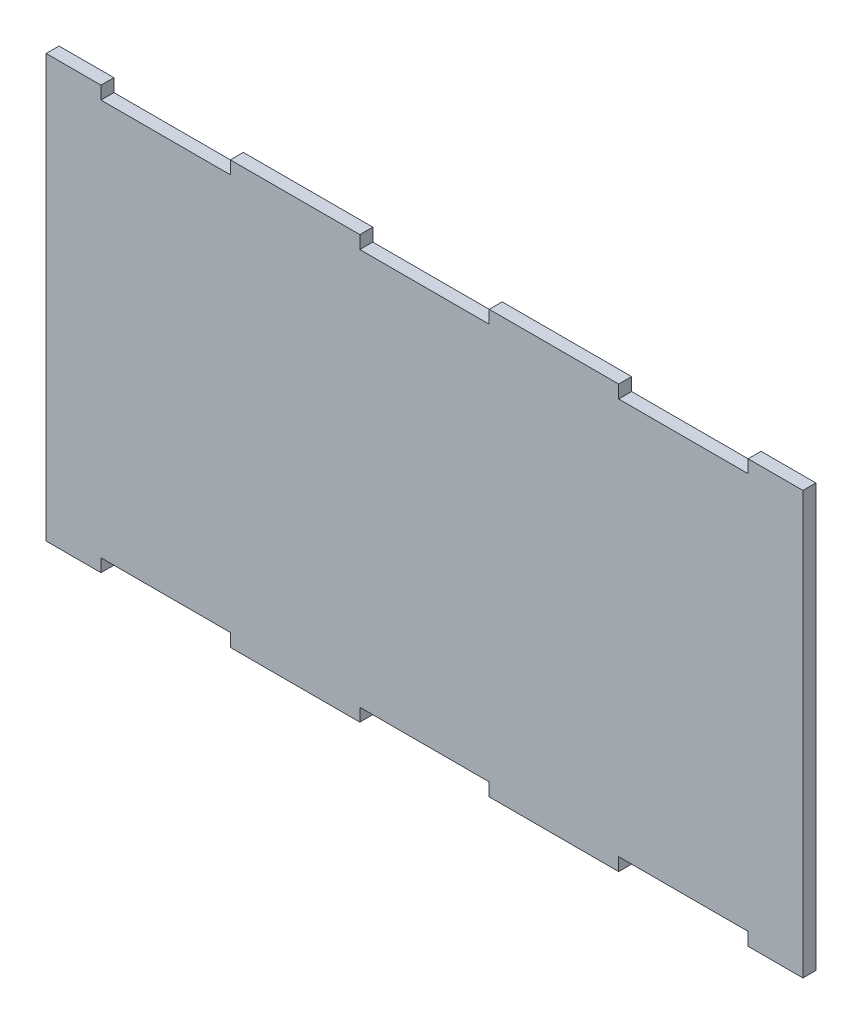
ISO-10303-21;
HEADER;
FILE_DESCRIPTION(('STEP AP214'),'2;1');
FILE_NAME('part.step','',(''),(''),'','','');
FILE_SCHEMA(('AUTOMOTIVE_DESIGN { 1 0 10303 214 1 1 1 1 }'));
ENDSEC;
DATA;
#1=APPLICATION_CONTEXT('core data for automotive mechanical design processes');
#2=APPLICATION_PROTOCOL_DEFINITION('international standard','automotive_design',2000,#1);
#3=PRODUCT_CONTEXT('',#1,'mechanical');
#4=PRODUCT('Part','Part','',(#3));
#5=PRODUCT_RELATED_PRODUCT_CATEGORY('part','',(#4));
#6=PRODUCT_DEFINITION_FORMATION('','',#4);
#7=PRODUCT_DEFINITION_CONTEXT('part definition',#1,'design');
#8=PRODUCT_DEFINITION('design','',#6,#7);
#9=PRODUCT_DEFINITION_SHAPE('','',#8);
#10=(LENGTH_UNIT() NAMED_UNIT(*) SI_UNIT(.MILLI.,.METRE.));
#11=(NAMED_UNIT(*) PLANE_ANGLE_UNIT() SI_UNIT($,.RADIAN.));
#12=(NAMED_UNIT(*) SI_UNIT($,.STERADIAN.) SOLID_ANGLE_UNIT());
#13=UNCERTAINTY_MEASURE_WITH_UNIT(LENGTH_MEASURE(1.E-05),#10,'distance_accuracy_value','');
#14=(GEOMETRIC_REPRESENTATION_CONTEXT(3) GLOBAL_UNCERTAINTY_ASSIGNED_CONTEXT((#13)) GLOBAL_UNIT_ASSIGNED_CONTEXT((#10,
#11,#12)) REPRESENTATION_CONTEXT('',''));
#15=CARTESIAN_POINT('',(0.,0.,0.));
#16=DIRECTION('',(0.,0.,1.));
#17=DIRECTION('',(1.,0.,0.));
#18=AXIS2_PLACEMENT_3D('',#15,#16,#17);
#19=CARTESIAN_POINT('',(-74.26325,-41.43375,2.54));
#20=DIRECTION('',(0.,1.,0.));
#21=DIRECTION('',(0.,0.,1.));
#22=AXIS2_PLACEMENT_3D('',#19,#20,#21);
#23=PLANE('',#22);
#24=DIRECTION('',(0.,0.,1.));
#25=VECTOR('',#24,1.);
#26=CARTESIAN_POINT('',(63.5,-41.43375,0.));
#27=LINE('',#26,#25);
#28=CARTESIAN_POINT('',(63.5,-41.43375,0.));
#29=VERTEX_POINT('',#28);
#30=CARTESIAN_POINT('',(63.5,-41.43375,2.54));
#31=VERTEX_POINT('',#30);
#32=EDGE_CURVE('E254',#29,#31,#27,.T.);
#33=ORIENTED_EDGE('',*,*,#32,.F.);
#34=DIRECTION('',(1.,0.,0.));
#35=VECTOR('',#34,1.);
#36=CARTESIAN_POINT('',(-74.26325,-41.43375,0.));
#37=LINE('',#36,#35);
#38=CARTESIAN_POINT('',(74.26325,-41.43375,0.));
#39=VERTEX_POINT('',#38);
#40=EDGE_CURVE('E243',#29,#39,#37,.T.);
#41=ORIENTED_EDGE('',*,*,#40,.T.);
#42=DIRECTION('',(0.,0.,-1.));
#43=VECTOR('',#42,1.);
#44=CARTESIAN_POINT('',(74.26325,-41.43375,2.54));
#45=LINE('',#44,#43);
#46=CARTESIAN_POINT('',(74.26325,-41.43375,2.54));
#47=VERTEX_POINT('',#46);
#48=EDGE_CURVE('E401',#47,#39,#45,.T.);
#49=ORIENTED_EDGE('',*,*,#48,.F.);
#50=DIRECTION('',(1.,0.,0.));
#51=VECTOR('',#50,1.);
#52=CARTESIAN_POINT('',(-74.26325,-41.43375,2.54));
#53=LINE('',#52,#51);
#54=EDGE_CURVE('E397',#31,#47,#53,.T.);
#55=ORIENTED_EDGE('',*,*,#54,.F.);
#56=EDGE_LOOP('',(#33,#41,#49,#55));
#57=FACE_BOUND('',#56,.T.);
#58=ADVANCED_FACE('F39',(#57),#23,.F.);
#59=DIRECTION('',(0.,0.,1.));
#60=VECTOR('',#59,1.);
#61=CARTESIAN_POINT('',(38.1,-41.43375,0.));
#62=LINE('',#61,#60);
#63=CARTESIAN_POINT('',(38.1,-41.43375,0.));
#64=VERTEX_POINT('',#63);
#65=CARTESIAN_POINT('',(38.1,-41.43375,2.54));
#66=VERTEX_POINT('',#65);
#67=EDGE_CURVE('E257',#64,#66,#62,.T.);
#68=ORIENTED_EDGE('',*,*,#67,.T.);
#69=CARTESIAN_POINT('',(12.7,-41.43375,2.54));
#70=VERTEX_POINT('',#69);
#71=EDGE_CURVE('E518',#70,#66,#53,.T.);
#72=ORIENTED_EDGE('',*,*,#71,.F.);
#73=DIRECTION('',(0.,0.,1.));
#74=VECTOR('',#73,1.);
#75=CARTESIAN_POINT('',(12.7,-41.43375,0.));
#76=LINE('',#75,#74);
#77=CARTESIAN_POINT('',(12.7,-41.43375,0.));
#78=VERTEX_POINT('',#77);
#79=EDGE_CURVE('E252',#78,#70,#76,.T.);
#80=ORIENTED_EDGE('',*,*,#79,.F.);
#81=EDGE_CURVE('E799',#78,#64,#37,.T.);
#82=ORIENTED_EDGE('',*,*,#81,.T.);
#83=EDGE_LOOP('',(#68,#72,#80,#82));
#84=FACE_BOUND('',#83,.T.);
#85=ADVANCED_FACE('F492',(#84),#23,.F.);
#86=DIRECTION('',(0.,0.,1.));
#87=VECTOR('',#86,1.);
#88=CARTESIAN_POINT('',(-12.7,-41.43375,0.));
#89=LINE('',#88,#87);
#90=CARTESIAN_POINT('',(-12.7,-41.43375,0.));
#91=VERTEX_POINT('',#90);
#92=CARTESIAN_POINT('',(-12.7,-41.43375,2.54));
#93=VERTEX_POINT('',#92);
#94=EDGE_CURVE('E279',#91,#93,#89,.T.);
#95=ORIENTED_EDGE('',*,*,#94,.T.);
#96=CARTESIAN_POINT('',(-38.1,-41.43375,2.54));
#97=VERTEX_POINT('',#96);
#98=EDGE_CURVE('E402',#97,#93,#53,.T.);
#99=ORIENTED_EDGE('',*,*,#98,.F.);
#100=DIRECTION('',(0.,0.,1.));
#101=VECTOR('',#100,1.);
#102=CARTESIAN_POINT('',(-38.1,-41.43375,0.));
#103=LINE('',#102,#101);
#104=CARTESIAN_POINT('',(-38.1,-41.43375,0.));
#105=VERTEX_POINT('',#104);
#106=EDGE_CURVE('E273',#105,#97,#103,.T.);
#107=ORIENTED_EDGE('',*,*,#106,.F.);
#108=EDGE_CURVE('E414',#105,#91,#37,.T.);
#109=ORIENTED_EDGE('',*,*,#108,.T.);
#110=EDGE_LOOP('',(#95,#99,#107,#109));
#111=FACE_BOUND('',#110,.T.);
#112=ADVANCED_FACE('F498',(#111),#23,.F.);
#113=DIRECTION('',(0.,0.,1.));
#114=VECTOR('',#113,1.);
#115=CARTESIAN_POINT('',(-63.5,-41.43375,0.));
#116=LINE('',#115,#114);
#117=CARTESIAN_POINT('',(-63.5,-41.43375,0.));
#118=VERTEX_POINT('',#117);
#119=CARTESIAN_POINT('',(-63.5,-41.43375,2.54));
#120=VERTEX_POINT('',#119);
#121=EDGE_CURVE('E302',#118,#120,#116,.T.);
#122=ORIENTED_EDGE('',*,*,#121,.T.);
#123=CARTESIAN_POINT('',(-74.26325,-41.43375,2.54));
#124=VERTEX_POINT('',#123);
#125=EDGE_CURVE('E398',#124,#120,#53,.T.);
#126=ORIENTED_EDGE('',*,*,#125,.F.);
#127=DIRECTION('',(0.,0.,-1.));
#128=VECTOR('',#127,1.);
#129=CARTESIAN_POINT('',(-74.26325,-41.43375,2.54));
#130=LINE('',#129,#128);
#131=CARTESIAN_POINT('',(-74.26325,-41.43375,0.));
#132=VERTEX_POINT('',#131);
#133=EDGE_CURVE('E417',#124,#132,#130,.T.);
#134=ORIENTED_EDGE('',*,*,#133,.T.);
#135=EDGE_CURVE('E390',#132,#118,#37,.T.);
#136=ORIENTED_EDGE('',*,*,#135,.T.);
#137=EDGE_LOOP('',(#122,#126,#134,#136));
#138=FACE_BOUND('',#137,.T.);
#139=ADVANCED_FACE('F433',(#138),#23,.F.);
#140=CARTESIAN_POINT('',(0.,0.,2.54));
#141=DIRECTION('',(0.,0.,1.));
#142=DIRECTION('',(1.,0.,0.));
#143=AXIS2_PLACEMENT_3D('',#140,#141,#142);
#144=PLANE('',#143);
#145=DIRECTION('',(1.,0.,0.));
#146=VECTOR('',#145,1.);
#147=CARTESIAN_POINT('',(63.5,-38.89375,2.54));
#148=LINE('',#147,#146);
#149=CARTESIAN_POINT('',(38.1,-38.89375,2.54));
#150=VERTEX_POINT('',#149);
#151=CARTESIAN_POINT('',(63.5,-38.89375,2.54));
#152=VERTEX_POINT('',#151);
#153=EDGE_CURVE('E247',#150,#152,#148,.T.);
#154=ORIENTED_EDGE('',*,*,#153,.T.);
#155=DIRECTION('',(0.,-1.,0.));
#156=VECTOR('',#155,1.);
#157=CARTESIAN_POINT('',(63.5,-41.43375,2.54));
#158=LINE('',#157,#156);
#159=EDGE_CURVE('E237',#152,#31,#158,.T.);
#160=ORIENTED_EDGE('',*,*,#159,.T.);
#161=ORIENTED_EDGE('',*,*,#54,.T.);
#162=DIRECTION('',(0.,1.,0.));
#163=VECTOR('',#162,1.);
#164=CARTESIAN_POINT('',(74.26325,41.43375,2.54));
#165=LINE('',#164,#163);
#166=CARTESIAN_POINT('',(74.26325,41.43375,2.54));
#167=VERTEX_POINT('',#166);
#168=EDGE_CURVE('E386',#47,#167,#165,.T.);
#169=ORIENTED_EDGE('',*,*,#168,.T.);
#170=DIRECTION('',(-1.,0.,0.));
#171=VECTOR('',#170,1.);
#172=CARTESIAN_POINT('',(-74.26325,41.43375,2.54));
#173=LINE('',#172,#171);
#174=CARTESIAN_POINT('',(63.5,41.43375,2.54));
#175=VERTEX_POINT('',#174);
#176=EDGE_CURVE('E391',#167,#175,#173,.T.);
#177=ORIENTED_EDGE('',*,*,#176,.T.);
#178=DIRECTION('',(0.,1.,0.));
#179=VECTOR('',#178,1.);
#180=CARTESIAN_POINT('',(63.5,41.43375,2.54));
#181=LINE('',#180,#179);
#182=CARTESIAN_POINT('',(63.5,38.89375,2.54));
#183=VERTEX_POINT('',#182);
#184=EDGE_CURVE('E329',#183,#175,#181,.T.);
#185=ORIENTED_EDGE('',*,*,#184,.F.);
#186=DIRECTION('',(1.,0.,0.));
#187=VECTOR('',#186,1.);
#188=CARTESIAN_POINT('',(63.5,38.89375,2.54));
#189=LINE('',#188,#187);
#190=CARTESIAN_POINT('',(38.1,38.89375,2.54));
#191=VERTEX_POINT('',#190);
#192=EDGE_CURVE('E364',#191,#183,#189,.T.);
#193=ORIENTED_EDGE('',*,*,#192,.F.);
#194=DIRECTION('',(0.,-1.,0.));
#195=VECTOR('',#194,1.);
#196=CARTESIAN_POINT('',(38.1,41.43375,2.54));
#197=LINE('',#196,#195);
#198=CARTESIAN_POINT('',(38.1,41.43375,2.54));
#199=VERTEX_POINT('',#198);
#200=EDGE_CURVE('E372',#199,#191,#197,.T.);
#201=ORIENTED_EDGE('',*,*,#200,.F.);
#202=CARTESIAN_POINT('',(12.7,41.43375,2.54));
#203=VERTEX_POINT('',#202);
#204=EDGE_CURVE('E395',#199,#203,#173,.T.);
#205=ORIENTED_EDGE('',*,*,#204,.T.);
#206=DIRECTION('',(0.,1.,0.));
#207=VECTOR('',#206,1.);
#208=CARTESIAN_POINT('',(12.7,41.43375,2.54));
#209=LINE('',#208,#207);
#210=CARTESIAN_POINT('',(12.7,38.89375,2.54));
#211=VERTEX_POINT('',#210);
#212=EDGE_CURVE('E319',#211,#203,#209,.T.);
#213=ORIENTED_EDGE('',*,*,#212,.F.);
#214=DIRECTION('',(1.,0.,0.));
#215=VECTOR('',#214,1.);
#216=CARTESIAN_POINT('',(12.7,38.89375,2.54));
#217=LINE('',#216,#215);
#218=CARTESIAN_POINT('',(-12.7,38.89375,2.54));
#219=VERTEX_POINT('',#218);
#220=EDGE_CURVE('E312',#219,#211,#217,.T.);
#221=ORIENTED_EDGE('',*,*,#220,.F.);
#222=DIRECTION('',(0.,-1.,0.));
#223=VECTOR('',#222,1.);
#224=CARTESIAN_POINT('',(-12.7,41.43375,2.54));
#225=LINE('',#224,#223);
#226=CARTESIAN_POINT('',(-12.7,41.43375,2.54));
#227=VERTEX_POINT('',#226);
#228=EDGE_CURVE('E321',#227,#219,#225,.T.);
#229=ORIENTED_EDGE('',*,*,#228,.F.);
#230=CARTESIAN_POINT('',(-38.1,41.43375,2.54));
#231=VERTEX_POINT('',#230);
#232=EDGE_CURVE('E440',#227,#231,#173,.T.);
#233=ORIENTED_EDGE('',*,*,#232,.T.);
#234=DIRECTION('',(0.,1.,0.));
#235=VECTOR('',#234,1.);
#236=CARTESIAN_POINT('',(-38.1,41.43375,2.54));
#237=LINE('',#236,#235);
#238=CARTESIAN_POINT('',(-38.1,38.89375,2.54));
#239=VERTEX_POINT('',#238);
#240=EDGE_CURVE('E256',#239,#231,#237,.T.);
#241=ORIENTED_EDGE('',*,*,#240,.F.);
#242=DIRECTION('',(1.,0.,0.));
#243=VECTOR('',#242,1.);
#244=CARTESIAN_POINT('',(-38.1,38.89375,2.54));
#245=LINE('',#244,#243);
#246=CARTESIAN_POINT('',(-63.5,38.89375,2.54));
#247=VERTEX_POINT('',#246);
#248=EDGE_CURVE('E340',#247,#239,#245,.T.);
#249=ORIENTED_EDGE('',*,*,#248,.F.);
#250=DIRECTION('',(0.,-1.,0.));
#251=VECTOR('',#250,1.);
#252=CARTESIAN_POINT('',(-63.5,41.43375,2.54));
#253=LINE('',#252,#251);
#254=CARTESIAN_POINT('',(-63.5,41.43375,2.54));
#255=VERTEX_POINT('',#254);
#256=EDGE_CURVE('E348',#255,#247,#253,.T.);
#257=ORIENTED_EDGE('',*,*,#256,.F.);
#258=CARTESIAN_POINT('',(-74.26325,41.43375,2.54));
#259=VERTEX_POINT('',#258);
#260=EDGE_CURVE('E389',#255,#259,#173,.T.);
#261=ORIENTED_EDGE('',*,*,#260,.T.);
#262=DIRECTION('',(0.,-1.,0.));
#263=VECTOR('',#262,1.);
#264=CARTESIAN_POINT('',(-74.26325,41.43375,2.54));
#265=LINE('',#264,#263);
#266=EDGE_CURVE('E394',#259,#124,#265,.T.);
#267=ORIENTED_EDGE('',*,*,#266,.T.);
#268=ORIENTED_EDGE('',*,*,#125,.T.);
#269=DIRECTION('',(0.,1.,0.));
#270=VECTOR('',#269,1.);
#271=CARTESIAN_POINT('',(-63.5,-41.43375,2.54));
#272=LINE('',#271,#270);
#273=CARTESIAN_POINT('',(-63.5,-38.89375,2.54));
#274=VERTEX_POINT('',#273);
#275=EDGE_CURVE('E287',#120,#274,#272,.T.);
#276=ORIENTED_EDGE('',*,*,#275,.T.);
#277=DIRECTION('',(1.,0.,0.));
#278=VECTOR('',#277,1.);
#279=CARTESIAN_POINT('',(-38.1,-38.89375,2.54));
#280=LINE('',#279,#278);
#281=CARTESIAN_POINT('',(-38.1,-38.89375,2.54));
#282=VERTEX_POINT('',#281);
#283=EDGE_CURVE('E296',#274,#282,#280,.T.);
#284=ORIENTED_EDGE('',*,*,#283,.T.);
#285=DIRECTION('',(0.,-1.,0.));
#286=VECTOR('',#285,1.);
#287=CARTESIAN_POINT('',(-38.1,-41.43375,2.54));
#288=LINE('',#287,#286);
#289=EDGE_CURVE('E293',#282,#97,#288,.T.);
#290=ORIENTED_EDGE('',*,*,#289,.T.);
#291=ORIENTED_EDGE('',*,*,#98,.T.);
#292=DIRECTION('',(0.,1.,0.));
#293=VECTOR('',#292,1.);
#294=CARTESIAN_POINT('',(-12.7,-41.43375,2.54));
#295=LINE('',#294,#293);
#296=CARTESIAN_POINT('',(-12.7,-38.89375,2.54));
#297=VERTEX_POINT('',#296);
#298=EDGE_CURVE('E264',#93,#297,#295,.T.);
#299=ORIENTED_EDGE('',*,*,#298,.T.);
#300=DIRECTION('',(1.,0.,0.));
#301=VECTOR('',#300,1.);
#302=CARTESIAN_POINT('',(12.7,-38.89375,2.54));
#303=LINE('',#302,#301);
#304=CARTESIAN_POINT('',(12.7,-38.89375,2.54));
#305=VERTEX_POINT('',#304);
#306=EDGE_CURVE('E272',#297,#305,#303,.T.);
#307=ORIENTED_EDGE('',*,*,#306,.T.);
#308=DIRECTION('',(0.,-1.,0.));
#309=VECTOR('',#308,1.);
#310=CARTESIAN_POINT('',(12.7,-41.43375,2.54));
#311=LINE('',#310,#309);
#312=EDGE_CURVE('E269',#305,#70,#311,.T.);
#313=ORIENTED_EDGE('',*,*,#312,.T.);
#314=ORIENTED_EDGE('',*,*,#71,.T.);
#315=DIRECTION('',(0.,1.,0.));
#316=VECTOR('',#315,1.);
#317=CARTESIAN_POINT('',(38.1,-41.43375,2.54));
#318=LINE('',#317,#316);
#319=EDGE_CURVE('E244',#66,#150,#318,.T.);
#320=ORIENTED_EDGE('',*,*,#319,.T.);
#321=EDGE_LOOP('',(#154,#160,#161,#169,#177,#185,#193,#201,#205,#213,#221,#229,#233,#241,#249,
#257,#261,#267,#268,#276,#284,#290,#291,#299,#307,#313,#314,#320));
#322=FACE_BOUND('',#321,.T.);
#323=ADVANCED_FACE('F436',(#322),#144,.T.);
#324=CARTESIAN_POINT('',(0.,0.,0.));
#325=DIRECTION('',(0.,0.,1.));
#326=DIRECTION('',(1.,0.,0.));
#327=AXIS2_PLACEMENT_3D('',#324,#325,#326);
#328=PLANE('',#327);
#329=DIRECTION('',(0.,-1.,0.));
#330=VECTOR('',#329,1.);
#331=CARTESIAN_POINT('',(63.5,-41.43375,0.));
#332=LINE('',#331,#330);
#333=CARTESIAN_POINT('',(63.5,-38.89375,0.));
#334=VERTEX_POINT('',#333);
#335=EDGE_CURVE('E231',#334,#29,#332,.T.);
#336=ORIENTED_EDGE('',*,*,#335,.F.);
#337=DIRECTION('',(1.,0.,0.));
#338=VECTOR('',#337,1.);
#339=CARTESIAN_POINT('',(63.5,-38.89375,0.));
#340=LINE('',#339,#338);
#341=CARTESIAN_POINT('',(38.1,-38.89375,0.));
#342=VERTEX_POINT('',#341);
#343=EDGE_CURVE('E222',#342,#334,#340,.T.);
#344=ORIENTED_EDGE('',*,*,#343,.F.);
#345=DIRECTION('',(0.,1.,0.));
#346=VECTOR('',#345,1.);
#347=CARTESIAN_POINT('',(38.1,-41.43375,0.));
#348=LINE('',#347,#346);
#349=EDGE_CURVE('E230',#64,#342,#348,.T.);
#350=ORIENTED_EDGE('',*,*,#349,.F.);
#351=ORIENTED_EDGE('',*,*,#81,.F.);
#352=DIRECTION('',(0.,-1.,0.));
#353=VECTOR('',#352,1.);
#354=CARTESIAN_POINT('',(12.7,-41.43375,0.));
#355=LINE('',#354,#353);
#356=CARTESIAN_POINT('',(12.7,-38.89375,0.));
#357=VERTEX_POINT('',#356);
#358=EDGE_CURVE('E261',#357,#78,#355,.T.);
#359=ORIENTED_EDGE('',*,*,#358,.F.);
#360=DIRECTION('',(1.,0.,0.));
#361=VECTOR('',#360,1.);
#362=CARTESIAN_POINT('',(12.7,-38.89375,0.));
#363=LINE('',#362,#361);
#364=CARTESIAN_POINT('',(-12.7,-38.89375,0.));
#365=VERTEX_POINT('',#364);
#366=EDGE_CURVE('E263',#365,#357,#363,.T.);
#367=ORIENTED_EDGE('',*,*,#366,.F.);
#368=DIRECTION('',(0.,1.,0.));
#369=VECTOR('',#368,1.);
#370=CARTESIAN_POINT('',(-12.7,-41.43375,0.));
#371=LINE('',#370,#369);
#372=EDGE_CURVE('E266',#91,#365,#371,.T.);
#373=ORIENTED_EDGE('',*,*,#372,.F.);
#374=ORIENTED_EDGE('',*,*,#108,.F.);
#375=DIRECTION('',(0.,-1.,0.));
#376=VECTOR('',#375,1.);
#377=CARTESIAN_POINT('',(-38.1,-41.43375,0.));
#378=LINE('',#377,#376);
#379=CARTESIAN_POINT('',(-38.1,-38.89375,0.));
#380=VERTEX_POINT('',#379);
#381=EDGE_CURVE('E284',#380,#105,#378,.T.);
#382=ORIENTED_EDGE('',*,*,#381,.F.);
#383=DIRECTION('',(1.,0.,0.));
#384=VECTOR('',#383,1.);
#385=CARTESIAN_POINT('',(-38.1,-38.89375,0.));
#386=LINE('',#385,#384);
#387=CARTESIAN_POINT('',(-63.5,-38.89375,0.));
#388=VERTEX_POINT('',#387);
#389=EDGE_CURVE('E286',#388,#380,#386,.T.);
#390=ORIENTED_EDGE('',*,*,#389,.F.);
#391=DIRECTION('',(0.,1.,0.));
#392=VECTOR('',#391,1.);
#393=CARTESIAN_POINT('',(-63.5,-41.43375,0.));
#394=LINE('',#393,#392);
#395=EDGE_CURVE('E289',#118,#388,#394,.T.);
#396=ORIENTED_EDGE('',*,*,#395,.F.);
#397=ORIENTED_EDGE('',*,*,#135,.F.);
#398=DIRECTION('',(0.,-1.,0.));
#399=VECTOR('',#398,1.);
#400=CARTESIAN_POINT('',(-74.26325,41.43375,0.));
#401=LINE('',#400,#399);
#402=CARTESIAN_POINT('',(-74.26325,41.43375,0.));
#403=VERTEX_POINT('',#402);
#404=EDGE_CURVE('E409',#403,#132,#401,.T.);
#405=ORIENTED_EDGE('',*,*,#404,.F.);
#406=DIRECTION('',(-1.,0.,0.));
#407=VECTOR('',#406,1.);
#408=CARTESIAN_POINT('',(-74.26325,41.43375,0.));
#409=LINE('',#408,#407);
#410=CARTESIAN_POINT('',(-63.5,41.43375,0.));
#411=VERTEX_POINT('',#410);
#412=EDGE_CURVE('E405',#411,#403,#409,.T.);
#413=ORIENTED_EDGE('',*,*,#412,.F.);
#414=DIRECTION('',(0.,-1.,0.));
#415=VECTOR('',#414,1.);
#416=CARTESIAN_POINT('',(-63.5,41.43375,0.));
#417=LINE('',#416,#415);
#418=CARTESIAN_POINT('',(-63.5,38.89375,0.));
#419=VERTEX_POINT('',#418);
#420=EDGE_CURVE('E339',#411,#419,#417,.T.);
#421=ORIENTED_EDGE('',*,*,#420,.T.);
#422=DIRECTION('',(1.,0.,0.));
#423=VECTOR('',#422,1.);
#424=CARTESIAN_POINT('',(-38.1,38.89375,0.));
#425=LINE('',#424,#423);
#426=CARTESIAN_POINT('',(-38.1,38.89375,0.));
#427=VERTEX_POINT('',#426);
#428=EDGE_CURVE('E343',#419,#427,#425,.T.);
#429=ORIENTED_EDGE('',*,*,#428,.T.);
#430=DIRECTION('',(0.,1.,0.));
#431=VECTOR('',#430,1.);
#432=CARTESIAN_POINT('',(-38.1,41.43375,0.));
#433=LINE('',#432,#431);
#434=CARTESIAN_POINT('',(-38.1,41.43375,0.));
#435=VERTEX_POINT('',#434);
#436=EDGE_CURVE('E336',#427,#435,#433,.T.);
#437=ORIENTED_EDGE('',*,*,#436,.T.);
#438=CARTESIAN_POINT('',(-12.7,41.43375,0.));
#439=VERTEX_POINT('',#438);
#440=EDGE_CURVE('E469',#439,#435,#409,.T.);
#441=ORIENTED_EDGE('',*,*,#440,.F.);
#442=DIRECTION('',(0.,-1.,0.));
#443=VECTOR('',#442,1.);
#444=CARTESIAN_POINT('',(-12.7,41.43375,0.));
#445=LINE('',#444,#443);
#446=CARTESIAN_POINT('',(-12.7,38.89375,0.));
#447=VERTEX_POINT('',#446);
#448=EDGE_CURVE('E311',#439,#447,#445,.T.);
#449=ORIENTED_EDGE('',*,*,#448,.T.);
#450=DIRECTION('',(1.,0.,0.));
#451=VECTOR('',#450,1.);
#452=CARTESIAN_POINT('',(12.7,38.89375,0.));
#453=LINE('',#452,#451);
#454=CARTESIAN_POINT('',(12.7,38.89375,0.));
#455=VERTEX_POINT('',#454);
#456=EDGE_CURVE('E315',#447,#455,#453,.T.);
#457=ORIENTED_EDGE('',*,*,#456,.T.);
#458=DIRECTION('',(0.,1.,0.));
#459=VECTOR('',#458,1.);
#460=CARTESIAN_POINT('',(12.7,41.43375,0.));
#461=LINE('',#460,#459);
#462=CARTESIAN_POINT('',(12.7,41.43375,0.));
#463=VERTEX_POINT('',#462);
#464=EDGE_CURVE('E308',#455,#463,#461,.T.);
#465=ORIENTED_EDGE('',*,*,#464,.T.);
#466=CARTESIAN_POINT('',(38.1,41.43375,0.));
#467=VERTEX_POINT('',#466);
#468=EDGE_CURVE('E410',#467,#463,#409,.T.);
#469=ORIENTED_EDGE('',*,*,#468,.F.);
#470=DIRECTION('',(0.,-1.,0.));
#471=VECTOR('',#470,1.);
#472=CARTESIAN_POINT('',(38.1,41.43375,0.));
#473=LINE('',#472,#471);
#474=CARTESIAN_POINT('',(38.1,38.89375,0.));
#475=VERTEX_POINT('',#474);
#476=EDGE_CURVE('E363',#467,#475,#473,.T.);
#477=ORIENTED_EDGE('',*,*,#476,.T.);
#478=DIRECTION('',(1.,0.,0.));
#479=VECTOR('',#478,1.);
#480=CARTESIAN_POINT('',(63.5,38.89375,0.));
#481=LINE('',#480,#479);
#482=CARTESIAN_POINT('',(63.5,38.89375,0.));
#483=VERTEX_POINT('',#482);
#484=EDGE_CURVE('E367',#475,#483,#481,.T.);
#485=ORIENTED_EDGE('',*,*,#484,.T.);
#486=DIRECTION('',(0.,1.,0.));
#487=VECTOR('',#486,1.);
#488=CARTESIAN_POINT('',(63.5,41.43375,0.));
#489=LINE('',#488,#487);
#490=CARTESIAN_POINT('',(63.5,41.43375,0.));
#491=VERTEX_POINT('',#490);
#492=EDGE_CURVE('E360',#483,#491,#489,.T.);
#493=ORIENTED_EDGE('',*,*,#492,.T.);
#494=CARTESIAN_POINT('',(74.26325,41.43375,0.));
#495=VERTEX_POINT('',#494);
#496=EDGE_CURVE('E406',#495,#491,#409,.T.);
#497=ORIENTED_EDGE('',*,*,#496,.F.);
#498=DIRECTION('',(0.,1.,0.));
#499=VECTOR('',#498,1.);
#500=CARTESIAN_POINT('',(74.26325,41.43375,0.));
#501=LINE('',#500,#499);
#502=EDGE_CURVE('E379',#39,#495,#501,.T.);
#503=ORIENTED_EDGE('',*,*,#502,.F.);
#504=ORIENTED_EDGE('',*,*,#40,.F.);
#505=EDGE_LOOP('',(#336,#344,#350,#351,#359,#367,#373,#374,#382,#390,#396,#397,#405,#413,#421,
#429,#437,#441,#449,#457,#465,#469,#477,#485,#493,#497,#503,#504));
#506=FACE_BOUND('',#505,.T.);
#507=ADVANCED_FACE('F241',(#506),#328,.F.);
#508=CARTESIAN_POINT('',(-74.26325,41.43375,2.54));
#509=DIRECTION('',(0.,-1.,0.));
#510=DIRECTION('',(0.,0.,-1.));
#511=AXIS2_PLACEMENT_3D('',#508,#509,#510);
#512=PLANE('',#511);
#513=ORIENTED_EDGE('',*,*,#468,.T.);
#514=DIRECTION('',(0.,0.,1.));
#515=VECTOR('',#514,1.);
#516=CARTESIAN_POINT('',(12.7,41.43375,0.));
#517=LINE('',#516,#515);
#518=EDGE_CURVE('E318',#463,#203,#517,.T.);
#519=ORIENTED_EDGE('',*,*,#518,.T.);
#520=ORIENTED_EDGE('',*,*,#204,.F.);
#521=DIRECTION('',(0.,0.,1.));
#522=VECTOR('',#521,1.);
#523=CARTESIAN_POINT('',(38.1,41.43375,0.));
#524=LINE('',#523,#522);
#525=EDGE_CURVE('E382',#467,#199,#524,.T.);
#526=ORIENTED_EDGE('',*,*,#525,.F.);
#527=EDGE_LOOP('',(#513,#519,#520,#526));
#528=FACE_BOUND('',#527,.T.);
#529=ADVANCED_FACE('F454',(#528),#512,.F.);
#530=ORIENTED_EDGE('',*,*,#232,.F.);
#531=DIRECTION('',(0.,0.,1.));
#532=VECTOR('',#531,1.);
#533=CARTESIAN_POINT('',(-12.7,41.43375,0.));
#534=LINE('',#533,#532);
#535=EDGE_CURVE('E332',#439,#227,#534,.T.);
#536=ORIENTED_EDGE('',*,*,#535,.F.);
#537=ORIENTED_EDGE('',*,*,#440,.T.);
#538=DIRECTION('',(0.,0.,1.));
#539=VECTOR('',#538,1.);
#540=CARTESIAN_POINT('',(-38.1,41.43375,0.));
#541=LINE('',#540,#539);
#542=EDGE_CURVE('E346',#435,#231,#541,.T.);
#543=ORIENTED_EDGE('',*,*,#542,.T.);
#544=EDGE_LOOP('',(#530,#536,#537,#543));
#545=FACE_BOUND('',#544,.T.);
#546=ADVANCED_FACE('F467',(#545),#512,.F.);
#547=ORIENTED_EDGE('',*,*,#496,.T.);
#548=DIRECTION('',(0.,0.,1.));
#549=VECTOR('',#548,1.);
#550=CARTESIAN_POINT('',(63.5,41.43375,0.));
#551=LINE('',#550,#549);
#552=EDGE_CURVE('E370',#491,#175,#551,.T.);
#553=ORIENTED_EDGE('',*,*,#552,.T.);
#554=ORIENTED_EDGE('',*,*,#176,.F.);
#555=DIRECTION('',(0.,0.,-1.));
#556=VECTOR('',#555,1.);
#557=CARTESIAN_POINT('',(74.26325,41.43375,2.54));
#558=LINE('',#557,#556);
#559=EDGE_CURVE('E11',#167,#495,#558,.T.);
#560=ORIENTED_EDGE('',*,*,#559,.T.);
#561=EDGE_LOOP('',(#547,#553,#554,#560));
#562=FACE_BOUND('',#561,.T.);
#563=ADVANCED_FACE('F480',(#562),#512,.F.);
#564=CARTESIAN_POINT('',(74.26325,41.43375,2.54));
#565=DIRECTION('',(-1.,0.,0.));
#566=DIRECTION('',(0.,0.,1.));
#567=AXIS2_PLACEMENT_3D('',#564,#565,#566);
#568=PLANE('',#567);
#569=ORIENTED_EDGE('',*,*,#502,.T.);
#570=ORIENTED_EDGE('',*,*,#559,.F.);
#571=ORIENTED_EDGE('',*,*,#168,.F.);
#572=ORIENTED_EDGE('',*,*,#48,.T.);
#573=EDGE_LOOP('',(#569,#570,#571,#572));
#574=FACE_BOUND('',#573,.T.);
#575=ADVANCED_FACE('F41',(#574),#568,.F.);
#576=ORIENTED_EDGE('',*,*,#260,.F.);
#577=DIRECTION('',(0.,0.,1.));
#578=VECTOR('',#577,1.);
#579=CARTESIAN_POINT('',(-63.5,41.43375,0.));
#580=LINE('',#579,#578);
#581=EDGE_CURVE('E356',#411,#255,#580,.T.);
#582=ORIENTED_EDGE('',*,*,#581,.F.);
#583=ORIENTED_EDGE('',*,*,#412,.T.);
#584=DIRECTION('',(0.,0.,-1.));
#585=VECTOR('',#584,1.);
#586=CARTESIAN_POINT('',(-74.26325,41.43375,2.54));
#587=LINE('',#586,#585);
#588=EDGE_CURVE('E47',#259,#403,#587,.T.);
#589=ORIENTED_EDGE('',*,*,#588,.F.);
#590=EDGE_LOOP('',(#576,#582,#583,#589));
#591=FACE_BOUND('',#590,.T.);
#592=ADVANCED_FACE('F478',(#591),#512,.F.);
#593=CARTESIAN_POINT('',(-74.26325,41.43375,2.54));
#594=DIRECTION('',(1.,0.,0.));
#595=DIRECTION('',(0.,0.,-1.));
#596=AXIS2_PLACEMENT_3D('',#593,#594,#595);
#597=PLANE('',#596);
#598=ORIENTED_EDGE('',*,*,#404,.T.);
#599=ORIENTED_EDGE('',*,*,#133,.F.);
#600=ORIENTED_EDGE('',*,*,#266,.F.);
#601=ORIENTED_EDGE('',*,*,#588,.T.);
#602=EDGE_LOOP('',(#598,#599,#600,#601));
#603=FACE_BOUND('',#602,.T.);
#604=ADVANCED_FACE('F424',(#603),#597,.F.);
#605=CARTESIAN_POINT('',(63.5,41.43375,0.));
#606=DIRECTION('',(1.,0.,0.));
#607=DIRECTION('',(0.,0.,-1.));
#608=AXIS2_PLACEMENT_3D('',#605,#606,#607);
#609=PLANE('',#608);
#610=ORIENTED_EDGE('',*,*,#184,.T.);
#611=ORIENTED_EDGE('',*,*,#552,.F.);
#612=ORIENTED_EDGE('',*,*,#492,.F.);
#613=DIRECTION('',(0.,0.,1.));
#614=VECTOR('',#613,1.);
#615=CARTESIAN_POINT('',(63.5,38.89375,0.));
#616=LINE('',#615,#614);
#617=EDGE_CURVE('E377',#483,#183,#616,.T.);
#618=ORIENTED_EDGE('',*,*,#617,.T.);
#619=EDGE_LOOP('',(#610,#611,#612,#618));
#620=FACE_BOUND('',#619,.T.);
#621=ADVANCED_FACE('F485',(#620),#609,.F.);
#622=CARTESIAN_POINT('',(63.5,38.89375,0.));
#623=DIRECTION('',(0.,-1.,0.));
#624=DIRECTION('',(0.,0.,-1.));
#625=AXIS2_PLACEMENT_3D('',#622,#623,#624);
#626=PLANE('',#625);
#627=ORIENTED_EDGE('',*,*,#192,.T.);
#628=ORIENTED_EDGE('',*,*,#617,.F.);
#629=ORIENTED_EDGE('',*,*,#484,.F.);
#630=DIRECTION('',(0.,0.,1.));
#631=VECTOR('',#630,1.);
#632=CARTESIAN_POINT('',(38.1,38.89375,0.));
#633=LINE('',#632,#631);
#634=EDGE_CURVE('E380',#475,#191,#633,.T.);
#635=ORIENTED_EDGE('',*,*,#634,.T.);
#636=EDGE_LOOP('',(#627,#628,#629,#635));
#637=FACE_BOUND('',#636,.T.);
#638=ADVANCED_FACE('F529',(#637),#626,.F.);
#639=CARTESIAN_POINT('',(38.1,41.43375,0.));
#640=DIRECTION('',(-1.,0.,0.));
#641=DIRECTION('',(0.,0.,1.));
#642=AXIS2_PLACEMENT_3D('',#639,#640,#641);
#643=PLANE('',#642);
#644=ORIENTED_EDGE('',*,*,#200,.T.);
#645=ORIENTED_EDGE('',*,*,#634,.F.);
#646=ORIENTED_EDGE('',*,*,#476,.F.);
#647=ORIENTED_EDGE('',*,*,#525,.T.);
#648=EDGE_LOOP('',(#644,#645,#646,#647));
#649=FACE_BOUND('',#648,.T.);
#650=ADVANCED_FACE('F532',(#649),#643,.F.);
#651=CARTESIAN_POINT('',(-38.1,41.43375,0.));
#652=DIRECTION('',(1.,0.,0.));
#653=DIRECTION('',(0.,0.,-1.));
#654=AXIS2_PLACEMENT_3D('',#651,#652,#653);
#655=PLANE('',#654);
#656=ORIENTED_EDGE('',*,*,#240,.T.);
#657=ORIENTED_EDGE('',*,*,#542,.F.);
#658=ORIENTED_EDGE('',*,*,#436,.F.);
#659=DIRECTION('',(0.,0.,1.));
#660=VECTOR('',#659,1.);
#661=CARTESIAN_POINT('',(-38.1,38.89375,0.));
#662=LINE('',#661,#660);
#663=EDGE_CURVE('E322',#427,#239,#662,.T.);
#664=ORIENTED_EDGE('',*,*,#663,.T.);
#665=EDGE_LOOP('',(#656,#657,#658,#664));
#666=FACE_BOUND('',#665,.T.);
#667=ADVANCED_FACE('F472',(#666),#655,.F.);
#668=CARTESIAN_POINT('',(-38.1,38.89375,0.));
#669=DIRECTION('',(0.,-1.,0.));
#670=DIRECTION('',(0.,0.,-1.));
#671=AXIS2_PLACEMENT_3D('',#668,#669,#670);
#672=PLANE('',#671);
#673=ORIENTED_EDGE('',*,*,#248,.T.);
#674=ORIENTED_EDGE('',*,*,#663,.F.);
#675=ORIENTED_EDGE('',*,*,#428,.F.);
#676=DIRECTION('',(0.,0.,1.));
#677=VECTOR('',#676,1.);
#678=CARTESIAN_POINT('',(-63.5,38.89375,0.));
#679=LINE('',#678,#677);
#680=EDGE_CURVE('E354',#419,#247,#679,.T.);
#681=ORIENTED_EDGE('',*,*,#680,.T.);
#682=EDGE_LOOP('',(#673,#674,#675,#681));
#683=FACE_BOUND('',#682,.T.);
#684=ADVANCED_FACE('F475',(#683),#672,.F.);
#685=CARTESIAN_POINT('',(-63.5,41.43375,0.));
#686=DIRECTION('',(-1.,0.,0.));
#687=DIRECTION('',(0.,0.,1.));
#688=AXIS2_PLACEMENT_3D('',#685,#686,#687);
#689=PLANE('',#688);
#690=ORIENTED_EDGE('',*,*,#256,.T.);
#691=ORIENTED_EDGE('',*,*,#680,.F.);
#692=ORIENTED_EDGE('',*,*,#420,.F.);
#693=ORIENTED_EDGE('',*,*,#581,.T.);
#694=EDGE_LOOP('',(#690,#691,#692,#693));
#695=FACE_BOUND('',#694,.T.);
#696=ADVANCED_FACE('F477',(#695),#689,.F.);
#697=CARTESIAN_POINT('',(12.7,41.43375,0.));
#698=DIRECTION('',(1.,0.,0.));
#699=DIRECTION('',(0.,0.,-1.));
#700=AXIS2_PLACEMENT_3D('',#697,#698,#699);
#701=PLANE('',#700);
#702=ORIENTED_EDGE('',*,*,#212,.T.);
#703=ORIENTED_EDGE('',*,*,#518,.F.);
#704=ORIENTED_EDGE('',*,*,#464,.F.);
#705=DIRECTION('',(0.,0.,1.));
#706=VECTOR('',#705,1.);
#707=CARTESIAN_POINT('',(12.7,38.89375,0.));
#708=LINE('',#707,#706);
#709=EDGE_CURVE('E327',#455,#211,#708,.T.);
#710=ORIENTED_EDGE('',*,*,#709,.T.);
#711=EDGE_LOOP('',(#702,#703,#704,#710));
#712=FACE_BOUND('',#711,.T.);
#713=ADVANCED_FACE('F458',(#712),#701,.F.);
#714=CARTESIAN_POINT('',(12.7,38.89375,0.));
#715=DIRECTION('',(0.,-1.,0.));
#716=DIRECTION('',(0.,0.,-1.));
#717=AXIS2_PLACEMENT_3D('',#714,#715,#716);
#718=PLANE('',#717);
#719=ORIENTED_EDGE('',*,*,#220,.T.);
#720=ORIENTED_EDGE('',*,*,#709,.F.);
#721=ORIENTED_EDGE('',*,*,#456,.F.);
#722=DIRECTION('',(0.,0.,1.));
#723=VECTOR('',#722,1.);
#724=CARTESIAN_POINT('',(-12.7,38.89375,0.));
#725=LINE('',#724,#723);
#726=EDGE_CURVE('E330',#447,#219,#725,.T.);
#727=ORIENTED_EDGE('',*,*,#726,.T.);
#728=EDGE_LOOP('',(#719,#720,#721,#727));
#729=FACE_BOUND('',#728,.T.);
#730=ADVANCED_FACE('F462',(#729),#718,.F.);
#731=CARTESIAN_POINT('',(-12.7,41.43375,0.));
#732=DIRECTION('',(-1.,0.,0.));
#733=DIRECTION('',(0.,0.,1.));
#734=AXIS2_PLACEMENT_3D('',#731,#732,#733);
#735=PLANE('',#734);
#736=ORIENTED_EDGE('',*,*,#228,.T.);
#737=ORIENTED_EDGE('',*,*,#726,.F.);
#738=ORIENTED_EDGE('',*,*,#448,.F.);
#739=ORIENTED_EDGE('',*,*,#535,.T.);
#740=EDGE_LOOP('',(#736,#737,#738,#739));
#741=FACE_BOUND('',#740,.T.);
#742=ADVANCED_FACE('F464',(#741),#735,.F.);
#743=CARTESIAN_POINT('',(-38.1,-41.43375,0.));
#744=DIRECTION('',(-1.,0.,0.));
#745=DIRECTION('',(0.,0.,1.));
#746=AXIS2_PLACEMENT_3D('',#743,#744,#745);
#747=PLANE('',#746);
#748=ORIENTED_EDGE('',*,*,#289,.F.);
#749=DIRECTION('',(0.,0.,1.));
#750=VECTOR('',#749,1.);
#751=CARTESIAN_POINT('',(-38.1,-38.89375,0.));
#752=LINE('',#751,#750);
#753=EDGE_CURVE('E292',#380,#282,#752,.T.);
#754=ORIENTED_EDGE('',*,*,#753,.F.);
#755=ORIENTED_EDGE('',*,*,#381,.T.);
#756=ORIENTED_EDGE('',*,*,#106,.T.);
#757=EDGE_LOOP('',(#748,#754,#755,#756));
#758=FACE_BOUND('',#757,.T.);
#759=ADVANCED_FACE('F655',(#758),#747,.T.);
#760=CARTESIAN_POINT('',(-63.5,-41.43375,0.));
#761=DIRECTION('',(1.,0.,0.));
#762=DIRECTION('',(0.,0.,-1.));
#763=AXIS2_PLACEMENT_3D('',#760,#761,#762);
#764=PLANE('',#763);
#765=ORIENTED_EDGE('',*,*,#275,.F.);
#766=ORIENTED_EDGE('',*,*,#121,.F.);
#767=ORIENTED_EDGE('',*,*,#395,.T.);
#768=DIRECTION('',(0.,0.,1.));
#769=VECTOR('',#768,1.);
#770=CARTESIAN_POINT('',(-63.5,-38.89375,0.));
#771=LINE('',#770,#769);
#772=EDGE_CURVE('E305',#388,#274,#771,.T.);
#773=ORIENTED_EDGE('',*,*,#772,.T.);
#774=EDGE_LOOP('',(#765,#766,#767,#773));
#775=FACE_BOUND('',#774,.T.);
#776=ADVANCED_FACE('F696',(#775),#764,.T.);
#777=CARTESIAN_POINT('',(-38.1,-38.89375,0.));
#778=DIRECTION('',(0.,-1.,0.));
#779=DIRECTION('',(0.,0.,-1.));
#780=AXIS2_PLACEMENT_3D('',#777,#778,#779);
#781=PLANE('',#780);
#782=ORIENTED_EDGE('',*,*,#283,.F.);
#783=ORIENTED_EDGE('',*,*,#772,.F.);
#784=ORIENTED_EDGE('',*,*,#389,.T.);
#785=ORIENTED_EDGE('',*,*,#753,.T.);
#786=EDGE_LOOP('',(#782,#783,#784,#785));
#787=FACE_BOUND('',#786,.T.);
#788=ADVANCED_FACE('F707',(#787),#781,.T.);
#789=CARTESIAN_POINT('',(12.7,-41.43375,0.));
#790=DIRECTION('',(-1.,0.,0.));
#791=DIRECTION('',(0.,0.,1.));
#792=AXIS2_PLACEMENT_3D('',#789,#790,#791);
#793=PLANE('',#792);
#794=ORIENTED_EDGE('',*,*,#312,.F.);
#795=DIRECTION('',(0.,0.,1.));
#796=VECTOR('',#795,1.);
#797=CARTESIAN_POINT('',(12.7,-38.89375,0.));
#798=LINE('',#797,#796);
#799=EDGE_CURVE('E268',#357,#305,#798,.T.);
#800=ORIENTED_EDGE('',*,*,#799,.F.);
#801=ORIENTED_EDGE('',*,*,#358,.T.);
#802=ORIENTED_EDGE('',*,*,#79,.T.);
#803=EDGE_LOOP('',(#794,#800,#801,#802));
#804=FACE_BOUND('',#803,.T.);
#805=ADVANCED_FACE('F718',(#804),#793,.T.);
#806=CARTESIAN_POINT('',(-12.7,-41.43375,0.));
#807=DIRECTION('',(1.,0.,0.));
#808=DIRECTION('',(0.,0.,-1.));
#809=AXIS2_PLACEMENT_3D('',#806,#807,#808);
#810=PLANE('',#809);
#811=ORIENTED_EDGE('',*,*,#298,.F.);
#812=ORIENTED_EDGE('',*,*,#94,.F.);
#813=ORIENTED_EDGE('',*,*,#372,.T.);
#814=DIRECTION('',(0.,0.,1.));
#815=VECTOR('',#814,1.);
#816=CARTESIAN_POINT('',(-12.7,-38.89375,0.));
#817=LINE('',#816,#815);
#818=EDGE_CURVE('E62',#365,#297,#817,.T.);
#819=ORIENTED_EDGE('',*,*,#818,.T.);
#820=EDGE_LOOP('',(#811,#812,#813,#819));
#821=FACE_BOUND('',#820,.T.);
#822=ADVANCED_FACE('F729',(#821),#810,.T.);
#823=CARTESIAN_POINT('',(12.7,-38.89375,0.));
#824=DIRECTION('',(0.,-1.,0.));
#825=DIRECTION('',(0.,0.,-1.));
#826=AXIS2_PLACEMENT_3D('',#823,#824,#825);
#827=PLANE('',#826);
#828=ORIENTED_EDGE('',*,*,#306,.F.);
#829=ORIENTED_EDGE('',*,*,#818,.F.);
#830=ORIENTED_EDGE('',*,*,#366,.T.);
#831=ORIENTED_EDGE('',*,*,#799,.T.);
#832=EDGE_LOOP('',(#828,#829,#830,#831));
#833=FACE_BOUND('',#832,.T.);
#834=ADVANCED_FACE('F740',(#833),#827,.T.);
#835=CARTESIAN_POINT('',(63.5,-41.43375,0.));
#836=DIRECTION('',(-1.,0.,0.));
#837=DIRECTION('',(0.,0.,1.));
#838=AXIS2_PLACEMENT_3D('',#835,#836,#837);
#839=PLANE('',#838);
#840=ORIENTED_EDGE('',*,*,#159,.F.);
#841=DIRECTION('',(0.,0.,1.));
#842=VECTOR('',#841,1.);
#843=CARTESIAN_POINT('',(63.5,-38.89375,0.));
#844=LINE('',#843,#842);
#845=EDGE_CURVE('E225',#334,#152,#844,.T.);
#846=ORIENTED_EDGE('',*,*,#845,.F.);
#847=ORIENTED_EDGE('',*,*,#335,.T.);
#848=ORIENTED_EDGE('',*,*,#32,.T.);
#849=EDGE_LOOP('',(#840,#846,#847,#848));
#850=FACE_BOUND('',#849,.T.);
#851=ADVANCED_FACE('F234',(#850),#839,.T.);
#852=CARTESIAN_POINT('',(38.1,-41.43375,0.));
#853=DIRECTION('',(1.,0.,0.));
#854=DIRECTION('',(0.,0.,-1.));
#855=AXIS2_PLACEMENT_3D('',#852,#853,#854);
#856=PLANE('',#855);
#857=ORIENTED_EDGE('',*,*,#319,.F.);
#858=ORIENTED_EDGE('',*,*,#67,.F.);
#859=ORIENTED_EDGE('',*,*,#349,.T.);
#860=DIRECTION('',(0.,0.,1.));
#861=VECTOR('',#860,1.);
#862=CARTESIAN_POINT('',(38.1,-38.89375,0.));
#863=LINE('',#862,#861);
#864=EDGE_CURVE('E54',#342,#150,#863,.T.);
#865=ORIENTED_EDGE('',*,*,#864,.T.);
#866=EDGE_LOOP('',(#857,#858,#859,#865));
#867=FACE_BOUND('',#866,.T.);
#868=ADVANCED_FACE('F759',(#867),#856,.T.);
#869=CARTESIAN_POINT('',(63.5,-38.89375,0.));
#870=DIRECTION('',(0.,-1.,0.));
#871=DIRECTION('',(0.,0.,-1.));
#872=AXIS2_PLACEMENT_3D('',#869,#870,#871);
#873=PLANE('',#872);
#874=ORIENTED_EDGE('',*,*,#153,.F.);
#875=ORIENTED_EDGE('',*,*,#864,.F.);
#876=ORIENTED_EDGE('',*,*,#343,.T.);
#877=ORIENTED_EDGE('',*,*,#845,.T.);
#878=EDGE_LOOP('',(#874,#875,#876,#877));
#879=FACE_BOUND('',#878,.T.);
#880=ADVANCED_FACE('F224',(#879),#873,.T.);
#881=CLOSED_SHELL('',(#58,#85,#112,#139,#323,#507,#529,#546,#563,#575,#592,#604,#621,#638,#650,
#667,#684,#696,#713,#730,#742,#759,#776,#788,#805,#822,#834,#851,#868,#880));
#882=MANIFOLD_SOLID_BREP('B2',#881);
#883=ADVANCED_BREP_SHAPE_REPRESENTATION('',(#18,#882),#14);
#884=SHAPE_DEFINITION_REPRESENTATION(#9,#883);
ENDSEC;
END-ISO-10303-21;
